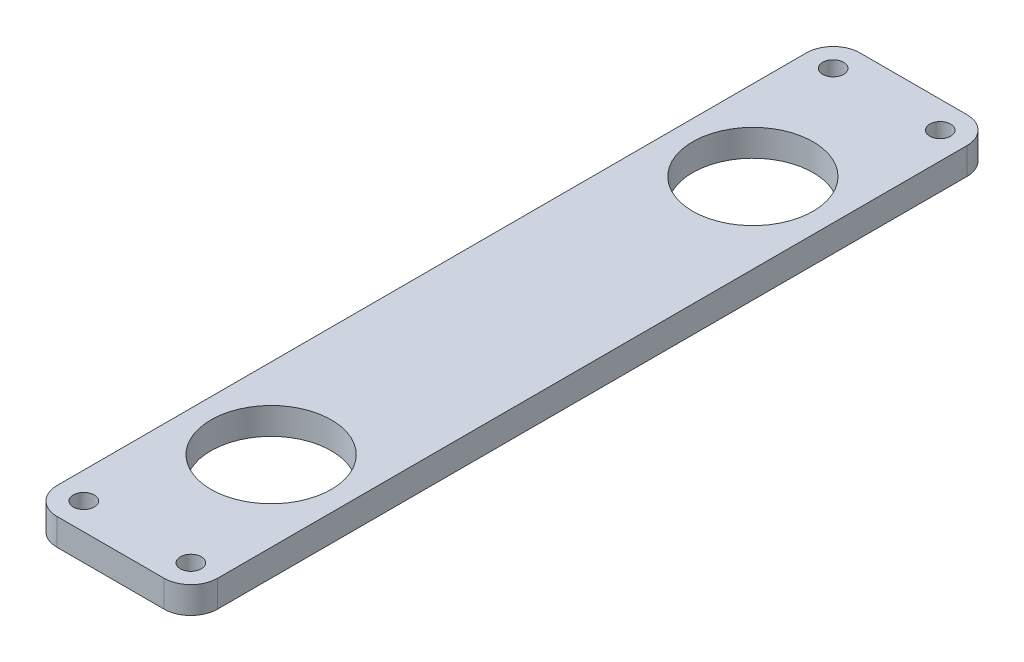
ISO-10303-21;
HEADER;
FILE_DESCRIPTION(('STEP AP214'),'2;1');
FILE_NAME('part.step','',(''),(''),'','','');
FILE_SCHEMA(('AUTOMOTIVE_DESIGN { 1 0 10303 214 1 1 1 1 }'));
ENDSEC;
DATA;
#1=APPLICATION_CONTEXT('core data for automotive mechanical design processes');
#2=APPLICATION_PROTOCOL_DEFINITION('international standard','automotive_design',2000,#1);
#3=PRODUCT_CONTEXT('',#1,'mechanical');
#4=PRODUCT('Part','Part','',(#3));
#5=PRODUCT_RELATED_PRODUCT_CATEGORY('part','',(#4));
#6=PRODUCT_DEFINITION_FORMATION('','',#4);
#7=PRODUCT_DEFINITION_CONTEXT('part definition',#1,'design');
#8=PRODUCT_DEFINITION('design','',#6,#7);
#9=PRODUCT_DEFINITION_SHAPE('','',#8);
#10=(LENGTH_UNIT() NAMED_UNIT(*) SI_UNIT(.MILLI.,.METRE.));
#11=(NAMED_UNIT(*) PLANE_ANGLE_UNIT() SI_UNIT($,.RADIAN.));
#12=(NAMED_UNIT(*) SI_UNIT($,.STERADIAN.) SOLID_ANGLE_UNIT());
#13=UNCERTAINTY_MEASURE_WITH_UNIT(LENGTH_MEASURE(1.E-05),#10,'distance_accuracy_value','');
#14=(GEOMETRIC_REPRESENTATION_CONTEXT(3) GLOBAL_UNCERTAINTY_ASSIGNED_CONTEXT((#13)) GLOBAL_UNIT_ASSIGNED_CONTEXT((#10,
#11,#12)) REPRESENTATION_CONTEXT('',''));
#15=CARTESIAN_POINT('',(0.,0.,0.));
#16=DIRECTION('',(0.,0.,1.));
#17=DIRECTION('',(1.,0.,0.));
#18=AXIS2_PLACEMENT_3D('',#15,#16,#17);
#19=CARTESIAN_POINT('',(0.,3.175,0.));
#20=DIRECTION('',(0.,-1.,0.));
#21=DIRECTION('',(0.,0.,-1.));
#22=AXIS2_PLACEMENT_3D('',#19,#20,#21);
#23=PLANE('',#22);
#24=DIRECTION('',(-1.,0.,0.));
#25=VECTOR('',#24,1.);
#26=CARTESIAN_POINT('',(-19.05,3.175,-152.4));
#27=LINE('',#26,#25);
#28=CARTESIAN_POINT('',(12.7,3.175,-152.4));
#29=VERTEX_POINT('',#28);
#30=CARTESIAN_POINT('',(-12.7,3.175,-152.4));
#31=VERTEX_POINT('',#30);
#32=EDGE_CURVE('E144',#29,#31,#27,.T.);
#33=ORIENTED_EDGE('',*,*,#32,.T.);
#34=CARTESIAN_POINT('',(-12.7,3.175,-146.05));
#35=DIRECTION('',(0.,-1.,0.));
#36=DIRECTION('',(0.,0.,-1.));
#37=AXIS2_PLACEMENT_3D('',#34,#35,#36);
#38=CIRCLE('',#37,6.35);
#39=CARTESIAN_POINT('',(-19.05,3.175,-146.05));
#40=VERTEX_POINT('',#39);
#41=EDGE_CURVE('E162',#31,#40,#38,.F.);
#42=ORIENTED_EDGE('',*,*,#41,.T.);
#43=DIRECTION('',(0.,0.,1.));
#44=VECTOR('',#43,1.);
#45=CARTESIAN_POINT('',(-19.05,3.175,38.1));
#46=LINE('',#45,#44);
#47=CARTESIAN_POINT('',(-19.05,3.175,31.75));
#48=VERTEX_POINT('',#47);
#49=EDGE_CURVE('E126',#40,#48,#46,.T.);
#50=ORIENTED_EDGE('',*,*,#49,.T.);
#51=CARTESIAN_POINT('',(-12.7,3.175,31.75));
#52=DIRECTION('',(0.,-1.,0.));
#53=DIRECTION('',(0.,0.,-1.));
#54=AXIS2_PLACEMENT_3D('',#51,#52,#53);
#55=CIRCLE('',#54,6.35);
#56=CARTESIAN_POINT('',(-12.7,3.175,38.1));
#57=VERTEX_POINT('',#56);
#58=EDGE_CURVE('E158',#48,#57,#55,.F.);
#59=ORIENTED_EDGE('',*,*,#58,.T.);
#60=DIRECTION('',(1.,0.,0.));
#61=VECTOR('',#60,1.);
#62=CARTESIAN_POINT('',(-19.05,3.175,38.1));
#63=LINE('',#62,#61);
#64=CARTESIAN_POINT('',(12.7,3.175,38.1));
#65=VERTEX_POINT('',#64);
#66=EDGE_CURVE('E171',#57,#65,#63,.T.);
#67=ORIENTED_EDGE('',*,*,#66,.T.);
#68=CARTESIAN_POINT('',(12.7,3.175,31.75));
#69=DIRECTION('',(0.,-1.,0.));
#70=DIRECTION('',(0.,0.,-1.));
#71=AXIS2_PLACEMENT_3D('',#68,#69,#70);
#72=CIRCLE('',#71,6.35);
#73=CARTESIAN_POINT('',(19.05,3.175,31.75));
#74=VERTEX_POINT('',#73);
#75=EDGE_CURVE('E61',#65,#74,#72,.F.);
#76=ORIENTED_EDGE('',*,*,#75,.T.);
#77=DIRECTION('',(0.,0.,-1.));
#78=VECTOR('',#77,1.);
#79=CARTESIAN_POINT('',(19.05,3.175,38.1));
#80=LINE('',#79,#78);
#81=CARTESIAN_POINT('',(19.05,3.175,-146.05));
#82=VERTEX_POINT('',#81);
#83=EDGE_CURVE('E177',#74,#82,#80,.T.);
#84=ORIENTED_EDGE('',*,*,#83,.T.);
#85=CARTESIAN_POINT('',(12.7,3.175,-146.05));
#86=DIRECTION('',(0.,-1.,0.));
#87=DIRECTION('',(0.,0.,-1.));
#88=AXIS2_PLACEMENT_3D('',#85,#86,#87);
#89=CIRCLE('',#88,6.35);
#90=EDGE_CURVE('E160',#82,#29,#89,.F.);
#91=ORIENTED_EDGE('',*,*,#90,.T.);
#92=EDGE_LOOP('',(#33,#42,#50,#59,#67,#76,#84,#91));
#93=FACE_BOUND('',#92,.T.);
#94=CARTESIAN_POINT('',(0.,3.175,0.));
#95=DIRECTION('',(0.,1.,0.));
#96=DIRECTION('',(0.,0.,1.));
#97=AXIS2_PLACEMENT_3D('',#94,#95,#96);
#98=CIRCLE('',#97,14.2875);
#99=CARTESIAN_POINT('',(0.,3.175,14.2875));
#100=VERTEX_POINT('',#99);
#101=EDGE_CURVE('E135',#100,#100,#98,.T.);
#102=ORIENTED_EDGE('',*,*,#101,.F.);
#103=EDGE_LOOP('',(#102));
#104=FACE_BOUND('',#103,.T.);
#105=CARTESIAN_POINT('',(0.,3.175,-114.3));
#106=DIRECTION('',(0.,1.,0.));
#107=DIRECTION('',(0.,0.,1.));
#108=AXIS2_PLACEMENT_3D('',#105,#106,#107);
#109=CIRCLE('',#108,14.2875);
#110=CARTESIAN_POINT('',(0.,3.175,-100.0125));
#111=VERTEX_POINT('',#110);
#112=EDGE_CURVE('E192',#111,#111,#109,.T.);
#113=ORIENTED_EDGE('',*,*,#112,.F.);
#114=EDGE_LOOP('',(#113));
#115=FACE_BOUND('',#114,.T.);
#116=CARTESIAN_POINT('',(-12.7,3.175,-146.05));
#117=DIRECTION('',(0.,1.,0.));
#118=DIRECTION('',(0.,0.,1.));
#119=AXIS2_PLACEMENT_3D('',#116,#117,#118);
#120=CIRCLE('',#119,2.48920000000001);
#121=CARTESIAN_POINT('',(-12.7,3.175,-143.5608));
#122=VERTEX_POINT('',#121);
#123=EDGE_CURVE('E197',#122,#122,#120,.T.);
#124=ORIENTED_EDGE('',*,*,#123,.F.);
#125=EDGE_LOOP('',(#124));
#126=FACE_BOUND('',#125,.T.);
#127=CARTESIAN_POINT('',(12.7,3.175,-146.05));
#128=DIRECTION('',(0.,1.,0.));
#129=DIRECTION('',(0.,0.,1.));
#130=AXIS2_PLACEMENT_3D('',#127,#128,#129);
#131=CIRCLE('',#130,2.48920000000001);
#132=CARTESIAN_POINT('',(12.7,3.175,-143.5608));
#133=VERTEX_POINT('',#132);
#134=EDGE_CURVE('E203',#133,#133,#131,.T.);
#135=ORIENTED_EDGE('',*,*,#134,.F.);
#136=EDGE_LOOP('',(#135));
#137=FACE_BOUND('',#136,.T.);
#138=CARTESIAN_POINT('',(-12.7,3.175,31.75));
#139=DIRECTION('',(0.,1.,0.));
#140=DIRECTION('',(0.,0.,1.));
#141=AXIS2_PLACEMENT_3D('',#138,#139,#140);
#142=CIRCLE('',#141,2.4892);
#143=CARTESIAN_POINT('',(-12.7,3.175,34.2392));
#144=VERTEX_POINT('',#143);
#145=EDGE_CURVE('E209',#144,#144,#142,.T.);
#146=ORIENTED_EDGE('',*,*,#145,.F.);
#147=EDGE_LOOP('',(#146));
#148=FACE_BOUND('',#147,.T.);
#149=CARTESIAN_POINT('',(12.7,3.175,31.75));
#150=DIRECTION('',(0.,1.,0.));
#151=DIRECTION('',(0.,0.,1.));
#152=AXIS2_PLACEMENT_3D('',#149,#150,#151);
#153=CIRCLE('',#152,2.4892);
#154=CARTESIAN_POINT('',(12.7,3.175,34.2392));
#155=VERTEX_POINT('',#154);
#156=EDGE_CURVE('E215',#155,#155,#153,.T.);
#157=ORIENTED_EDGE('',*,*,#156,.F.);
#158=EDGE_LOOP('',(#157));
#159=FACE_BOUND('',#158,.T.);
#160=ADVANCED_FACE('F39',(#93,#104,#115,#126,#137,#148,#159),#23,.F.);
#161=CARTESIAN_POINT('',(0.,-3.175,0.));
#162=DIRECTION('',(0.,-1.,0.));
#163=DIRECTION('',(0.,0.,-1.));
#164=AXIS2_PLACEMENT_3D('',#161,#162,#163);
#165=PLANE('',#164);
#166=CARTESIAN_POINT('',(-12.7,-3.175,31.75));
#167=DIRECTION('',(0.,1.,0.));
#168=DIRECTION('',(0.,0.,1.));
#169=AXIS2_PLACEMENT_3D('',#166,#167,#168);
#170=CIRCLE('',#169,2.4892);
#171=CARTESIAN_POINT('',(-12.7,-3.175,34.2392));
#172=VERTEX_POINT('',#171);
#173=EDGE_CURVE('E212',#172,#172,#170,.T.);
#174=ORIENTED_EDGE('',*,*,#173,.T.);
#175=EDGE_LOOP('',(#174));
#176=FACE_BOUND('',#175,.T.);
#177=CARTESIAN_POINT('',(-12.7,-3.175,-146.05));
#178=DIRECTION('',(0.,1.,0.));
#179=DIRECTION('',(0.,0.,1.));
#180=AXIS2_PLACEMENT_3D('',#177,#178,#179);
#181=CIRCLE('',#180,2.48920000000001);
#182=CARTESIAN_POINT('',(-12.7,-3.175,-143.5608));
#183=VERTEX_POINT('',#182);
#184=EDGE_CURVE('E200',#183,#183,#181,.T.);
#185=ORIENTED_EDGE('',*,*,#184,.T.);
#186=EDGE_LOOP('',(#185));
#187=FACE_BOUND('',#186,.T.);
#188=CARTESIAN_POINT('',(0.,-3.175,0.));
#189=DIRECTION('',(0.,1.,0.));
#190=DIRECTION('',(0.,0.,1.));
#191=AXIS2_PLACEMENT_3D('',#188,#189,#190);
#192=CIRCLE('',#191,14.2875);
#193=CARTESIAN_POINT('',(0.,-3.175,14.2875));
#194=VERTEX_POINT('',#193);
#195=EDGE_CURVE('E141',#194,#194,#192,.T.);
#196=ORIENTED_EDGE('',*,*,#195,.T.);
#197=EDGE_LOOP('',(#196));
#198=FACE_BOUND('',#197,.T.);
#199=DIRECTION('',(0.,0.,1.));
#200=VECTOR('',#199,1.);
#201=CARTESIAN_POINT('',(-19.05,-3.175,38.1));
#202=LINE('',#201,#200);
#203=CARTESIAN_POINT('',(-19.05,-3.175,-146.05));
#204=VERTEX_POINT('',#203);
#205=CARTESIAN_POINT('',(-19.05,-3.175,31.75));
#206=VERTEX_POINT('',#205);
#207=EDGE_CURVE('E123',#204,#206,#202,.T.);
#208=ORIENTED_EDGE('',*,*,#207,.F.);
#209=CARTESIAN_POINT('',(-12.7,-3.175,-146.05));
#210=DIRECTION('',(0.,-1.,0.));
#211=DIRECTION('',(0.,0.,-1.));
#212=AXIS2_PLACEMENT_3D('',#209,#210,#211);
#213=CIRCLE('',#212,6.35);
#214=CARTESIAN_POINT('',(-12.7,-3.175,-152.4));
#215=VERTEX_POINT('',#214);
#216=EDGE_CURVE('E106',#204,#215,#213,.T.);
#217=ORIENTED_EDGE('',*,*,#216,.T.);
#218=DIRECTION('',(-1.,0.,0.));
#219=VECTOR('',#218,1.);
#220=CARTESIAN_POINT('',(-19.05,-3.175,-152.4));
#221=LINE('',#220,#219);
#222=CARTESIAN_POINT('',(12.7,-3.175,-152.4));
#223=VERTEX_POINT('',#222);
#224=EDGE_CURVE('E148',#223,#215,#221,.T.);
#225=ORIENTED_EDGE('',*,*,#224,.F.);
#226=CARTESIAN_POINT('',(12.7,-3.175,-146.05));
#227=DIRECTION('',(0.,-1.,0.));
#228=DIRECTION('',(0.,0.,-1.));
#229=AXIS2_PLACEMENT_3D('',#226,#227,#228);
#230=CIRCLE('',#229,6.35);
#231=CARTESIAN_POINT('',(19.05,-3.175,-146.05));
#232=VERTEX_POINT('',#231);
#233=EDGE_CURVE('E117',#223,#232,#230,.T.);
#234=ORIENTED_EDGE('',*,*,#233,.T.);
#235=DIRECTION('',(0.,0.,-1.));
#236=VECTOR('',#235,1.);
#237=CARTESIAN_POINT('',(19.05,-3.175,38.1));
#238=LINE('',#237,#236);
#239=CARTESIAN_POINT('',(19.05,-3.175,31.75));
#240=VERTEX_POINT('',#239);
#241=EDGE_CURVE('E138',#240,#232,#238,.T.);
#242=ORIENTED_EDGE('',*,*,#241,.F.);
#243=CARTESIAN_POINT('',(12.7,-3.175,31.75));
#244=DIRECTION('',(0.,-1.,0.));
#245=DIRECTION('',(0.,0.,-1.));
#246=AXIS2_PLACEMENT_3D('',#243,#244,#245);
#247=CIRCLE('',#246,6.35);
#248=CARTESIAN_POINT('',(12.7,-3.175,38.1));
#249=VERTEX_POINT('',#248);
#250=EDGE_CURVE('E127',#240,#249,#247,.T.);
#251=ORIENTED_EDGE('',*,*,#250,.T.);
#252=DIRECTION('',(1.,0.,0.));
#253=VECTOR('',#252,1.);
#254=CARTESIAN_POINT('',(-19.05,-3.175,38.1));
#255=LINE('',#254,#253);
#256=CARTESIAN_POINT('',(-12.7,-3.175,38.1));
#257=VERTEX_POINT('',#256);
#258=EDGE_CURVE('E134',#257,#249,#255,.T.);
#259=ORIENTED_EDGE('',*,*,#258,.F.);
#260=CARTESIAN_POINT('',(-12.7,-3.175,31.75));
#261=DIRECTION('',(0.,-1.,0.));
#262=DIRECTION('',(0.,0.,-1.));
#263=AXIS2_PLACEMENT_3D('',#260,#261,#262);
#264=CIRCLE('',#263,6.35);
#265=EDGE_CURVE('E133',#257,#206,#264,.T.);
#266=ORIENTED_EDGE('',*,*,#265,.T.);
#267=EDGE_LOOP('',(#208,#217,#225,#234,#242,#251,#259,#266));
#268=FACE_BOUND('',#267,.T.);
#269=CARTESIAN_POINT('',(0.,-3.175,-114.3));
#270=DIRECTION('',(0.,1.,0.));
#271=DIRECTION('',(0.,0.,1.));
#272=AXIS2_PLACEMENT_3D('',#269,#270,#271);
#273=CIRCLE('',#272,14.2875);
#274=CARTESIAN_POINT('',(0.,-3.175,-100.0125));
#275=VERTEX_POINT('',#274);
#276=EDGE_CURVE('E194',#275,#275,#273,.T.);
#277=ORIENTED_EDGE('',*,*,#276,.T.);
#278=EDGE_LOOP('',(#277));
#279=FACE_BOUND('',#278,.T.);
#280=CARTESIAN_POINT('',(12.7,-3.175,-146.05));
#281=DIRECTION('',(0.,1.,0.));
#282=DIRECTION('',(0.,0.,1.));
#283=AXIS2_PLACEMENT_3D('',#280,#281,#282);
#284=CIRCLE('',#283,2.48920000000001);
#285=CARTESIAN_POINT('',(12.7,-3.175,-143.5608));
#286=VERTEX_POINT('',#285);
#287=EDGE_CURVE('E206',#286,#286,#284,.T.);
#288=ORIENTED_EDGE('',*,*,#287,.T.);
#289=EDGE_LOOP('',(#288));
#290=FACE_BOUND('',#289,.T.);
#291=CARTESIAN_POINT('',(12.7,-3.175,31.75));
#292=DIRECTION('',(0.,1.,0.));
#293=DIRECTION('',(0.,0.,1.));
#294=AXIS2_PLACEMENT_3D('',#291,#292,#293);
#295=CIRCLE('',#294,2.4892);
#296=CARTESIAN_POINT('',(12.7,-3.175,34.2392));
#297=VERTEX_POINT('',#296);
#298=EDGE_CURVE('E218',#297,#297,#295,.T.);
#299=ORIENTED_EDGE('',*,*,#298,.T.);
#300=EDGE_LOOP('',(#299));
#301=FACE_BOUND('',#300,.T.);
#302=ADVANCED_FACE('F130',(#176,#187,#198,#268,#279,#290,#301),#165,.T.);
#303=CARTESIAN_POINT('',(-19.05,3.175,38.1));
#304=DIRECTION('',(1.,0.,0.));
#305=DIRECTION('',(0.,0.,-1.));
#306=AXIS2_PLACEMENT_3D('',#303,#304,#305);
#307=PLANE('',#306);
#308=ORIENTED_EDGE('',*,*,#49,.F.);
#309=DIRECTION('',(0.,-1.,0.));
#310=VECTOR('',#309,1.);
#311=CARTESIAN_POINT('',(-19.05,3.175,-146.05));
#312=LINE('',#311,#310);
#313=EDGE_CURVE('E110',#40,#204,#312,.T.);
#314=ORIENTED_EDGE('',*,*,#313,.T.);
#315=ORIENTED_EDGE('',*,*,#207,.T.);
#316=DIRECTION('',(0.,-1.,0.));
#317=VECTOR('',#316,1.);
#318=CARTESIAN_POINT('',(-19.05,3.175,31.75));
#319=LINE('',#318,#317);
#320=EDGE_CURVE('E128',#206,#48,#319,.F.);
#321=ORIENTED_EDGE('',*,*,#320,.T.);
#322=EDGE_LOOP('',(#308,#314,#315,#321));
#323=FACE_BOUND('',#322,.T.);
#324=ADVANCED_FACE('F122',(#323),#307,.F.);
#325=CARTESIAN_POINT('',(-19.05,3.175,38.1));
#326=DIRECTION('',(0.,0.,-1.));
#327=DIRECTION('',(-1.,0.,0.));
#328=AXIS2_PLACEMENT_3D('',#325,#326,#327);
#329=PLANE('',#328);
#330=ORIENTED_EDGE('',*,*,#66,.F.);
#331=DIRECTION('',(0.,-1.,0.));
#332=VECTOR('',#331,1.);
#333=CARTESIAN_POINT('',(-12.7,3.175,38.1));
#334=LINE('',#333,#332);
#335=EDGE_CURVE('E11',#57,#257,#334,.T.);
#336=ORIENTED_EDGE('',*,*,#335,.T.);
#337=ORIENTED_EDGE('',*,*,#258,.T.);
#338=DIRECTION('',(0.,-1.,0.));
#339=VECTOR('',#338,1.);
#340=CARTESIAN_POINT('',(12.7,3.175,38.1));
#341=LINE('',#340,#339);
#342=EDGE_CURVE('E47',#249,#65,#341,.F.);
#343=ORIENTED_EDGE('',*,*,#342,.T.);
#344=EDGE_LOOP('',(#330,#336,#337,#343));
#345=FACE_BOUND('',#344,.T.);
#346=ADVANCED_FACE('F170',(#345),#329,.F.);
#347=CARTESIAN_POINT('',(19.05,3.175,38.1));
#348=DIRECTION('',(-1.,0.,0.));
#349=DIRECTION('',(0.,0.,1.));
#350=AXIS2_PLACEMENT_3D('',#347,#348,#349);
#351=PLANE('',#350);
#352=ORIENTED_EDGE('',*,*,#241,.T.);
#353=DIRECTION('',(0.,-1.,0.));
#354=VECTOR('',#353,1.);
#355=CARTESIAN_POINT('',(19.05,3.175,-146.05));
#356=LINE('',#355,#354);
#357=EDGE_CURVE('E54',#232,#82,#356,.F.);
#358=ORIENTED_EDGE('',*,*,#357,.T.);
#359=ORIENTED_EDGE('',*,*,#83,.F.);
#360=DIRECTION('',(0.,-1.,0.));
#361=VECTOR('',#360,1.);
#362=CARTESIAN_POINT('',(19.05,3.175,31.75));
#363=LINE('',#362,#361);
#364=EDGE_CURVE('E164',#74,#240,#363,.T.);
#365=ORIENTED_EDGE('',*,*,#364,.T.);
#366=EDGE_LOOP('',(#352,#358,#359,#365));
#367=FACE_BOUND('',#366,.T.);
#368=ADVANCED_FACE('F181',(#367),#351,.F.);
#369=CARTESIAN_POINT('',(-19.05,3.175,-152.4));
#370=DIRECTION('',(0.,0.,1.));
#371=DIRECTION('',(1.,0.,0.));
#372=AXIS2_PLACEMENT_3D('',#369,#370,#371);
#373=PLANE('',#372);
#374=ORIENTED_EDGE('',*,*,#224,.T.);
#375=DIRECTION('',(0.,-1.,0.));
#376=VECTOR('',#375,1.);
#377=CARTESIAN_POINT('',(-12.7,3.175,-152.4));
#378=LINE('',#377,#376);
#379=EDGE_CURVE('E111',#215,#31,#378,.F.);
#380=ORIENTED_EDGE('',*,*,#379,.T.);
#381=ORIENTED_EDGE('',*,*,#32,.F.);
#382=DIRECTION('',(0.,-1.,0.));
#383=VECTOR('',#382,1.);
#384=CARTESIAN_POINT('',(12.7,3.175,-152.4));
#385=LINE('',#384,#383);
#386=EDGE_CURVE('E116',#29,#223,#385,.T.);
#387=ORIENTED_EDGE('',*,*,#386,.T.);
#388=EDGE_LOOP('',(#374,#380,#381,#387));
#389=FACE_BOUND('',#388,.T.);
#390=ADVANCED_FACE('F188',(#389),#373,.F.);
#391=CARTESIAN_POINT('',(0.,3.175,0.));
#392=DIRECTION('',(0.,-1.,0.));
#393=DIRECTION('',(0.,0.,-1.));
#394=AXIS2_PLACEMENT_3D('',#391,#392,#393);
#395=CYLINDRICAL_SURFACE('',#394,14.2875);
#396=ORIENTED_EDGE('',*,*,#101,.T.);
#397=EDGE_LOOP('',(#396));
#398=FACE_BOUND('',#397,.T.);
#399=ORIENTED_EDGE('',*,*,#195,.F.);
#400=EDGE_LOOP('',(#399));
#401=FACE_BOUND('',#400,.T.);
#402=ADVANCED_FACE('F235',(#398,#401),#395,.F.);
#403=CARTESIAN_POINT('',(0.,3.175,-114.3));
#404=DIRECTION('',(0.,-1.,0.));
#405=DIRECTION('',(0.,0.,-1.));
#406=AXIS2_PLACEMENT_3D('',#403,#404,#405);
#407=CYLINDRICAL_SURFACE('',#406,14.2875);
#408=ORIENTED_EDGE('',*,*,#112,.T.);
#409=EDGE_LOOP('',(#408));
#410=FACE_BOUND('',#409,.T.);
#411=ORIENTED_EDGE('',*,*,#276,.F.);
#412=EDGE_LOOP('',(#411));
#413=FACE_BOUND('',#412,.T.);
#414=ADVANCED_FACE('F360',(#410,#413),#407,.F.);
#415=CARTESIAN_POINT('',(-12.7,3.175,-146.05));
#416=DIRECTION('',(0.,-1.,0.));
#417=DIRECTION('',(0.,0.,-1.));
#418=AXIS2_PLACEMENT_3D('',#415,#416,#417);
#419=CYLINDRICAL_SURFACE('',#418,2.48920000000001);
#420=ORIENTED_EDGE('',*,*,#123,.T.);
#421=EDGE_LOOP('',(#420));
#422=FACE_BOUND('',#421,.T.);
#423=ORIENTED_EDGE('',*,*,#184,.F.);
#424=EDGE_LOOP('',(#423));
#425=FACE_BOUND('',#424,.T.);
#426=ADVANCED_FACE('F349',(#422,#425),#419,.F.);
#427=CARTESIAN_POINT('',(12.7,3.175,-146.05));
#428=DIRECTION('',(0.,-1.,0.));
#429=DIRECTION('',(0.,0.,-1.));
#430=AXIS2_PLACEMENT_3D('',#427,#428,#429);
#431=CYLINDRICAL_SURFACE('',#430,2.48920000000001);
#432=ORIENTED_EDGE('',*,*,#134,.T.);
#433=EDGE_LOOP('',(#432));
#434=FACE_BOUND('',#433,.T.);
#435=ORIENTED_EDGE('',*,*,#287,.F.);
#436=EDGE_LOOP('',(#435));
#437=FACE_BOUND('',#436,.T.);
#438=ADVANCED_FACE('F338',(#434,#437),#431,.F.);
#439=CARTESIAN_POINT('',(-12.7,3.175,31.75));
#440=DIRECTION('',(0.,-1.,0.));
#441=DIRECTION('',(0.,0.,-1.));
#442=AXIS2_PLACEMENT_3D('',#439,#440,#441);
#443=CYLINDRICAL_SURFACE('',#442,2.4892);
#444=ORIENTED_EDGE('',*,*,#145,.T.);
#445=EDGE_LOOP('',(#444));
#446=FACE_BOUND('',#445,.T.);
#447=ORIENTED_EDGE('',*,*,#173,.F.);
#448=EDGE_LOOP('',(#447));
#449=FACE_BOUND('',#448,.T.);
#450=ADVANCED_FACE('F328',(#446,#449),#443,.F.);
#451=CARTESIAN_POINT('',(12.7,3.175,31.75));
#452=DIRECTION('',(0.,-1.,0.));
#453=DIRECTION('',(0.,0.,-1.));
#454=AXIS2_PLACEMENT_3D('',#451,#452,#453);
#455=CYLINDRICAL_SURFACE('',#454,2.4892);
#456=ORIENTED_EDGE('',*,*,#156,.T.);
#457=EDGE_LOOP('',(#456));
#458=FACE_BOUND('',#457,.T.);
#459=ORIENTED_EDGE('',*,*,#298,.F.);
#460=EDGE_LOOP('',(#459));
#461=FACE_BOUND('',#460,.T.);
#462=ADVANCED_FACE('F224',(#458,#461),#455,.F.);
#463=CARTESIAN_POINT('',(-12.7,3.175,-146.05));
#464=DIRECTION('',(0.,-1.,0.));
#465=DIRECTION('',(0.,0.,-1.));
#466=AXIS2_PLACEMENT_3D('',#463,#464,#465);
#467=CYLINDRICAL_SURFACE('',#466,6.35);
#468=ORIENTED_EDGE('',*,*,#41,.F.);
#469=ORIENTED_EDGE('',*,*,#379,.F.);
#470=ORIENTED_EDGE('',*,*,#216,.F.);
#471=ORIENTED_EDGE('',*,*,#313,.F.);
#472=EDGE_LOOP('',(#468,#469,#470,#471));
#473=FACE_BOUND('',#472,.T.);
#474=ADVANCED_FACE('F109',(#473),#467,.T.);
#475=CARTESIAN_POINT('',(12.7,3.175,-146.05));
#476=DIRECTION('',(0.,-1.,0.));
#477=DIRECTION('',(0.,0.,-1.));
#478=AXIS2_PLACEMENT_3D('',#475,#476,#477);
#479=CYLINDRICAL_SURFACE('',#478,6.35);
#480=ORIENTED_EDGE('',*,*,#90,.F.);
#481=ORIENTED_EDGE('',*,*,#357,.F.);
#482=ORIENTED_EDGE('',*,*,#233,.F.);
#483=ORIENTED_EDGE('',*,*,#386,.F.);
#484=EDGE_LOOP('',(#480,#481,#482,#483));
#485=FACE_BOUND('',#484,.T.);
#486=ADVANCED_FACE('F185',(#485),#479,.T.);
#487=CARTESIAN_POINT('',(-12.7,3.175,31.75));
#488=DIRECTION('',(0.,-1.,0.));
#489=DIRECTION('',(0.,0.,-1.));
#490=AXIS2_PLACEMENT_3D('',#487,#488,#489);
#491=CYLINDRICAL_SURFACE('',#490,6.35);
#492=ORIENTED_EDGE('',*,*,#58,.F.);
#493=ORIENTED_EDGE('',*,*,#320,.F.);
#494=ORIENTED_EDGE('',*,*,#265,.F.);
#495=ORIENTED_EDGE('',*,*,#335,.F.);
#496=EDGE_LOOP('',(#492,#493,#494,#495));
#497=FACE_BOUND('',#496,.T.);
#498=ADVANCED_FACE('F249',(#497),#491,.T.);
#499=CARTESIAN_POINT('',(12.7,3.175,31.75));
#500=DIRECTION('',(0.,-1.,0.));
#501=DIRECTION('',(0.,0.,-1.));
#502=AXIS2_PLACEMENT_3D('',#499,#500,#501);
#503=CYLINDRICAL_SURFACE('',#502,6.35);
#504=ORIENTED_EDGE('',*,*,#75,.F.);
#505=ORIENTED_EDGE('',*,*,#342,.F.);
#506=ORIENTED_EDGE('',*,*,#250,.F.);
#507=ORIENTED_EDGE('',*,*,#364,.F.);
#508=EDGE_LOOP('',(#504,#505,#506,#507));
#509=FACE_BOUND('',#508,.T.);
#510=ADVANCED_FACE('F41',(#509),#503,.T.);
#511=CLOSED_SHELL('',(#160,#302,#324,#346,#368,#390,#402,#414,#426,#438,#450,#462,#474,#486,
#498,#510));
#512=MANIFOLD_SOLID_BREP('B2',#511);
#513=ADVANCED_BREP_SHAPE_REPRESENTATION('',(#18,#512),#14);
#514=SHAPE_DEFINITION_REPRESENTATION(#9,#513);
ENDSEC;
END-ISO-10303-21;
